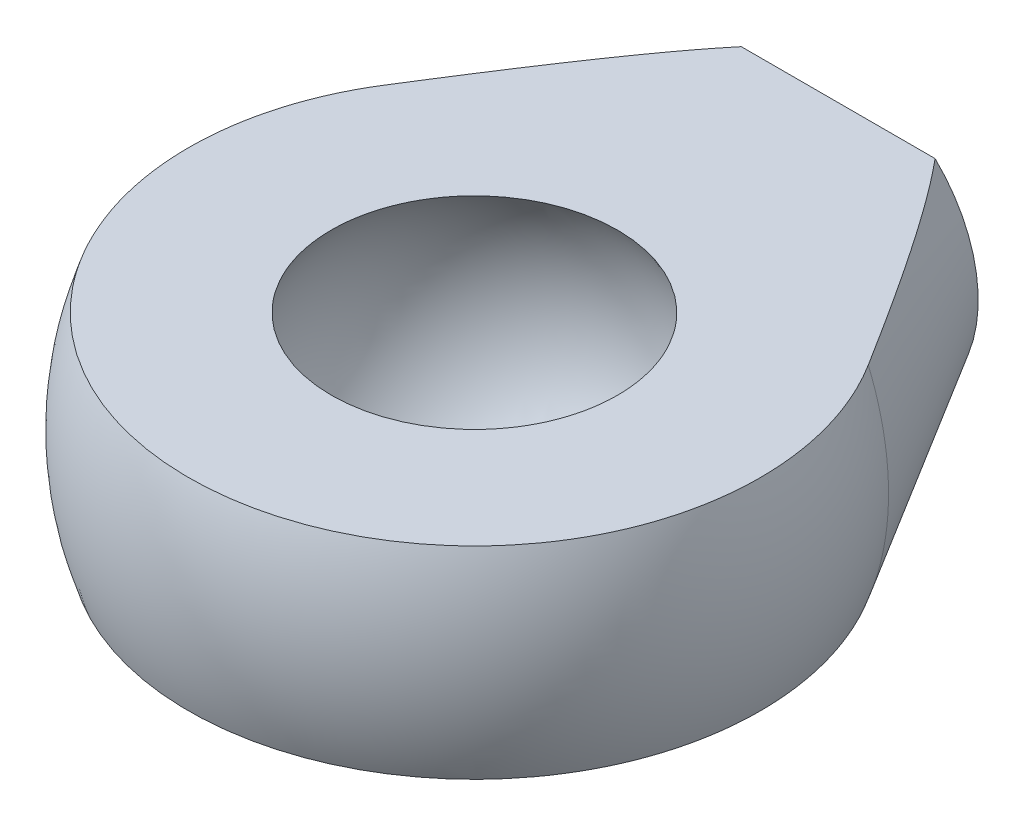
ISO-10303-21;
HEADER;
FILE_DESCRIPTION(('STEP AP214'),'2;1');
FILE_NAME('part.step','',(''),(''),'','','');
FILE_SCHEMA(('AUTOMOTIVE_DESIGN { 1 0 10303 214 1 1 1 1 }'));
ENDSEC;
DATA;
#1=APPLICATION_CONTEXT('core data for automotive mechanical design processes');
#2=APPLICATION_PROTOCOL_DEFINITION('international standard','automotive_design',2000,#1);
#3=PRODUCT_CONTEXT('',#1,'mechanical');
#4=PRODUCT('Part','Part','',(#3));
#5=PRODUCT_RELATED_PRODUCT_CATEGORY('part','',(#4));
#6=PRODUCT_DEFINITION_FORMATION('','',#4);
#7=PRODUCT_DEFINITION_CONTEXT('part definition',#1,'design');
#8=PRODUCT_DEFINITION('design','',#6,#7);
#9=PRODUCT_DEFINITION_SHAPE('','',#8);
#10=(LENGTH_UNIT() NAMED_UNIT(*) SI_UNIT(.MILLI.,.METRE.));
#11=(NAMED_UNIT(*) PLANE_ANGLE_UNIT() SI_UNIT($,.RADIAN.));
#12=(NAMED_UNIT(*) SI_UNIT($,.STERADIAN.) SOLID_ANGLE_UNIT());
#13=UNCERTAINTY_MEASURE_WITH_UNIT(LENGTH_MEASURE(1.E-05),#10,'distance_accuracy_value','');
#14=(GEOMETRIC_REPRESENTATION_CONTEXT(3) GLOBAL_UNCERTAINTY_ASSIGNED_CONTEXT((#13)) GLOBAL_UNIT_ASSIGNED_CONTEXT((#10,
#11,#12)) REPRESENTATION_CONTEXT('',''));
#15=CARTESIAN_POINT('',(0.,0.,0.));
#16=DIRECTION('',(0.,0.,1.));
#17=DIRECTION('',(1.,0.,0.));
#18=AXIS2_PLACEMENT_3D('',#15,#16,#17);
#19=CARTESIAN_POINT('',(0.,-1.5,0.));
#20=DIRECTION('',(0.,-1.,0.));
#21=DIRECTION('',(0.,0.,-1.));
#22=AXIS2_PLACEMENT_3D('',#19,#20,#21);
#23=PLANE('',#22);
#24=CARTESIAN_POINT('',(0.,-1.5,-2.1242881748953));
#25=CARTESIAN_POINT('',(-0.0596433501799828,-1.5,-2.12428781747219));
#26=CARTESIAN_POINT('',(-0.119297661436686,-1.5,-2.1217740317695));
#27=CARTESIAN_POINT('',(-0.238194036164754,-1.5,-2.11173523210911));
#28=CARTESIAN_POINT('',(-0.297435972708527,-1.5,-2.10420873867984));
#29=CARTESIAN_POINT('',(-0.415174931081974,-1.5,-2.08417838552678));
#30=CARTESIAN_POINT('',(-0.473670617593994,-1.5,-2.07166662480167));
#31=CARTESIAN_POINT('',(-0.589432561414114,-1.5,-2.04175198275292));
#32=CARTESIAN_POINT('',(-0.64669778027005,-1.5,-2.02434513225326));
#33=CARTESIAN_POINT('',(-0.815789120495362,-1.5,-1.96502260528374));
#34=CARTESIAN_POINT('',(-0.925195491964696,-1.5,-1.91595622676022));
#35=CARTESIAN_POINT('',(-1.1342056390693,-1.5,-1.80012611645185));
#36=CARTESIAN_POINT('',(-1.23380904186888,-1.5,-1.73336171191547));
#37=CARTESIAN_POINT('',(-1.37369788631977,-1.5,-1.62146155297761));
#38=CARTESIAN_POINT('',(-1.41876780957782,-1.5,-1.58217303095265));
#39=CARTESIAN_POINT('',(-1.50540664116416,-1.5,-1.49996985876689));
#40=CARTESIAN_POINT('',(-1.54697888310177,-1.5,-1.45705874126185));
#41=CARTESIAN_POINT('',(-1.62637882588234,-1.5,-1.36786636416899));
#42=CARTESIAN_POINT('',(-1.66420482194891,-1.5,-1.3215835867405));
#43=CARTESIAN_POINT('',(-1.73582719296633,-1.5,-1.22600022936428));
#44=CARTESIAN_POINT('',(-1.76962263258221,-1.5,-1.17669895294212));
#45=CARTESIAN_POINT('',(-1.86456337323386,-1.5,-1.02480495292632));
#46=CARTESIAN_POINT('',(-1.91934685152455,-1.5,-0.918127799425912));
#47=CARTESIAN_POINT('',(-2.01019330865678,-1.5,-0.697147758824447));
#48=CARTESIAN_POINT('',(-2.04625648743986,-1.5,-0.582844953183635));
#49=CARTESIAN_POINT('',(-2.09869085004264,-1.5,-0.349792473371839));
#50=CARTESIAN_POINT('',(-2.11506192869818,-1.5,-0.231042775456053));
#51=CARTESIAN_POINT('',(-2.12763041529676,-1.5,0.00751945629941201));
#52=CARTESIAN_POINT('',(-2.1238278232398,-1.5,0.127331990139092));
#53=CARTESIAN_POINT('',(-2.09617217962121,-1.5,0.364603956675449));
#54=CARTESIAN_POINT('',(-2.0723192351366,-1.5,0.482063401935145));
#55=CARTESIAN_POINT('',(-2.00519560751734,-1.5,0.71136598746992));
#56=CARTESIAN_POINT('',(-1.9619247169884,-1.5,0.823209067744962));
#57=CARTESIAN_POINT('',(-1.88347011997211,-1.5,0.984238281502264));
#58=CARTESIAN_POINT('',(-1.85504219726561,-1.5,1.03681775284116));
#59=CARTESIAN_POINT('',(-1.79385993013636,-1.5,1.13939783095768));
#60=CARTESIAN_POINT('',(-1.76110658905406,-1.5,1.18939903207195));
#61=CARTESIAN_POINT('',(-1.69151826126868,-1.5,1.28644075341421));
#62=CARTESIAN_POINT('',(-1.65468512939462,-1.5,1.33348260394752));
#63=CARTESIAN_POINT('',(-1.57716358218383,-1.5,1.42433445243777));
#64=CARTESIAN_POINT('',(-1.53647148049162,-1.5,1.46814128758095));
#65=CARTESIAN_POINT('',(-1.40911517678683,-1.5,1.59412107277989));
#66=CARTESIAN_POINT('',(-1.31707857018427,-1.50000000000002,1.67098189900128));
#67=CARTESIAN_POINT('',(-1.12139656031811,-1.49999999999998,1.808132936407));
#68=CARTESIAN_POINT('',(-1.01775159851692,-1.49999999999992,1.86842377744214));
#69=CARTESIAN_POINT('',(-0.855829763368571,-1.49999999999996,1.94518550519386));
#70=CARTESIAN_POINT('',(-0.800710618477808,-1.49999999999999,1.96851324836477));
#71=CARTESIAN_POINT('',(-0.68873286184711,-1.50000000000001,2.01042619941665));
#72=CARTESIAN_POINT('',(-0.631875699879535,-1.5,2.02901524538326));
#73=CARTESIAN_POINT('',(-0.516893262189035,-1.5,2.06130636473603));
#74=CARTESIAN_POINT('',(-0.458770144604808,-1.5,2.07501615507318));
#75=CARTESIAN_POINT('',(-0.341586815795197,-1.5,2.09749265104566));
#76=CARTESIAN_POINT('',(-0.282526886253126,-1.5,2.10626081462519));
#77=CARTESIAN_POINT('',(-0.186146182269117,-1.5,2.11644516688593));
#78=CARTESIAN_POINT('',(-0.148979720151722,-1.5,2.11938536415249));
#79=CARTESIAN_POINT('',(-0.0745435990049219,-1.5,2.12330697984244));
#80=CARTESIAN_POINT('',(-0.0372739399755158,-1.5,2.12428839826584));
#81=CARTESIAN_POINT('',(0.0596433501799825,-1.5,2.12428781747219));
#82=CARTESIAN_POINT('',(0.119297661436686,-1.5,2.1217740317695));
#83=CARTESIAN_POINT('',(0.238194036164754,-1.5,2.11173523210911));
#84=CARTESIAN_POINT('',(0.297435972708526,-1.5,2.10420873867984));
#85=CARTESIAN_POINT('',(0.415174931081974,-1.5,2.08417838552678));
#86=CARTESIAN_POINT('',(0.473670617593994,-1.5,2.07166662480167));
#87=CARTESIAN_POINT('',(0.589432561414114,-1.5,2.04175198275292));
#88=CARTESIAN_POINT('',(0.64669778027005,-1.5,2.02434513225326));
#89=CARTESIAN_POINT('',(0.815789120495362,-1.5,1.96502260528374));
#90=CARTESIAN_POINT('',(0.925195491964696,-1.5,1.91595622676022));
#91=CARTESIAN_POINT('',(1.1342056390693,-1.5,1.80012611645185));
#92=CARTESIAN_POINT('',(1.23380904186888,-1.5,1.73336171191547));
#93=CARTESIAN_POINT('',(1.37369788631977,-1.5,1.62146155297761));
#94=CARTESIAN_POINT('',(1.41876780957782,-1.5,1.58217303095265));
#95=CARTESIAN_POINT('',(1.50540664116416,-1.5,1.49996985876689));
#96=CARTESIAN_POINT('',(1.54697888310177,-1.5,1.45705874126185));
#97=CARTESIAN_POINT('',(1.62637882588234,-1.5,1.36786636416899));
#98=CARTESIAN_POINT('',(1.66420482194891,-1.5,1.3215835867405));
#99=CARTESIAN_POINT('',(1.73582719296633,-1.5,1.22600022936428));
#100=CARTESIAN_POINT('',(1.76962263258221,-1.5,1.17669895294212));
#101=CARTESIAN_POINT('',(1.86456337323386,-1.5,1.02480495292632));
#102=CARTESIAN_POINT('',(1.91934685152455,-1.5,0.918127799425912));
#103=CARTESIAN_POINT('',(2.01019330865678,-1.5,0.697147758824447));
#104=CARTESIAN_POINT('',(2.04625648743985,-1.5,0.582844953183636));
#105=CARTESIAN_POINT('',(2.09869085004264,-1.5,0.349792473371839));
#106=CARTESIAN_POINT('',(2.11506192869818,-1.5,0.231042775456054));
#107=CARTESIAN_POINT('',(2.12763041529676,-1.5,-0.00751945629941173));
#108=CARTESIAN_POINT('',(2.1238278232398,-1.5,-0.127331990139092));
#109=CARTESIAN_POINT('',(2.09617217962121,-1.5,-0.364603956675448));
#110=CARTESIAN_POINT('',(2.0723192351366,-1.5,-0.482063401935144));
#111=CARTESIAN_POINT('',(2.00519560751734,-1.5,-0.71136598746992));
#112=CARTESIAN_POINT('',(1.9619247169884,-1.5,-0.823209067744962));
#113=CARTESIAN_POINT('',(1.88347011997211,-1.5,-0.984238281502264));
#114=CARTESIAN_POINT('',(1.85504219726561,-1.5,-1.03681775284116));
#115=CARTESIAN_POINT('',(1.79385993013636,-1.5,-1.13939783095768));
#116=CARTESIAN_POINT('',(1.76110658905406,-1.5,-1.18939903207195));
#117=CARTESIAN_POINT('',(1.69151826126868,-1.5,-1.28644075341421));
#118=CARTESIAN_POINT('',(1.65468512939462,-1.5,-1.33348260394752));
#119=CARTESIAN_POINT('',(1.57716358218384,-1.5,-1.42433445243777));
#120=CARTESIAN_POINT('',(1.53647148049162,-1.5,-1.46814128758095));
#121=CARTESIAN_POINT('',(1.40911517678683,-1.5,-1.5941210727799));
#122=CARTESIAN_POINT('',(1.31707857018427,-1.50000000000002,-1.67098189900128));
#123=CARTESIAN_POINT('',(1.12139656031811,-1.49999999999998,-1.808132936407));
#124=CARTESIAN_POINT('',(1.01775159851692,-1.49999999999992,-1.86842377744214));
#125=CARTESIAN_POINT('',(0.855829763368571,-1.49999999999996,-1.94518550519386));
#126=CARTESIAN_POINT('',(0.800710618477808,-1.49999999999999,-1.96851324836477));
#127=CARTESIAN_POINT('',(0.68873286184711,-1.50000000000001,-2.01042619941665));
#128=CARTESIAN_POINT('',(0.631875699879535,-1.5,-2.02901524538326));
#129=CARTESIAN_POINT('',(0.516893262189034,-1.5,-2.06130636473603));
#130=CARTESIAN_POINT('',(0.458770144604808,-1.5,-2.07501615507318));
#131=CARTESIAN_POINT('',(0.341586815795196,-1.5,-2.09749265104567));
#132=CARTESIAN_POINT('',(0.282526886253126,-1.5,-2.10626081462519));
#133=CARTESIAN_POINT('',(0.186146182269116,-1.5,-2.11644516688593));
#134=CARTESIAN_POINT('',(0.148979720151722,-1.5,-2.11938536415249));
#135=CARTESIAN_POINT('',(0.0745435990049216,-1.5,-2.12330697984244));
#136=CARTESIAN_POINT('',(0.0372739399755155,-1.5,-2.12428839826584));
#137=CARTESIAN_POINT('',(0.,-1.5,-2.1242881748953));
#138=B_SPLINE_CURVE_WITH_KNOTS('',3,(#24,#25,#26,#27,#28,#29,#30,#31,#32,#33,#34,#35,#36,#37,
#38,#39,#40,#41,#42,#43,#44,#45,#46,#47,#48,#49,#50,#51,#52,#53,#54,#55,#56,#57,#58,#59,#60,#61,
#62,#63,#64,#65,#66,#67,#68,#69,#70,#71,#72,#73,#74,#75,#76,#77,#78,#79,#80,#81,#82,#83,#84,#85,
#86,#87,#88,#89,#90,#91,#92,#93,#94,#95,#96,#97,#98,#99,#100,#101,#102,#103,#104,#105,#106,#107,
#108,#109,#110,#111,#112,#113,#114,#115,#116,#117,#118,#119,#120,#121,#122,#123,#124,#125,#126,
#127,#128,#129,#130,#131,#132,#133,#134,#135,#136,#137),.UNSPECIFIED.,.T.,.F.,(4,2,2,2,2,2,2,2,
2,2,2,2,2,2,2,2,2,2,2,2,2,2,2,2,2,2,2,2,2,2,2,2,2,2,2,2,2,2,2,2,2,2,2,2,2,2,2,2,2,2,2,2,2,2,2,2,
4),(0.,0.178895736345397,0.357844296140533,0.537077601504677,0.716456659051143,1.07435969536906,
1.43227633853497,1.61146916237464,1.79048921734291,1.96959036689487,2.14873299829928,
2.50664474941335,2.86455267778396,3.22246251752633,3.58037235726871,3.93828028563932,
4.29619203675338,4.4753346681578,4.65443581770975,4.83345587267803,5.0126486965177,
5.37056533968356,5.72846837600143,5.90784743354792,6.08708073891208,6.26602929870725,
6.44492503505267,6.55672541042213,6.66852578579159,6.84742152213698,7.02637008193212,
7.20560338729626,7.38498244484273,7.74288548116064,8.10080212432655,8.27999494816622,
8.4590150031345,8.63811615268646,8.81725878409087,9.17517053520493,9.53307846357554,
9.89098830331792,10.2488981430603,10.6068060714309,10.964717822545,11.1438604539494,
11.3229616035013,11.5019816584696,11.6811744823093,12.0390911254751,12.396994161793,
12.5763732193395,12.7556065247037,12.9345550844988,13.1134508208443,13.2252511962137,
13.3370515715832),.UNSPECIFIED.);
#139=CARTESIAN_POINT('',(0.,-1.5,-2.1242881748953));
#140=VERTEX_POINT('',#139);
#141=EDGE_CURVE('E88',#140,#140,#138,.T.);
#142=ORIENTED_EDGE('',*,*,#141,.T.);
#143=EDGE_LOOP('',(#142));
#144=FACE_BOUND('',#143,.T.);
#145=CARTESIAN_POINT('',(-3.59687364247174,-1.5,-2.25000000002046));
#146=CARTESIAN_POINT('',(-3.66016648610274,-1.5,-2.14884358765808));
#147=CARTESIAN_POINT('',(-3.71916918238554,-1.5,-2.04500567807281));
#148=CARTESIAN_POINT('',(-3.82822206626107,-1.5,-1.83273662204977));
#149=CARTESIAN_POINT('',(-3.87827268237529,-1.5,-1.72430569577971));
#150=CARTESIAN_POINT('',(-3.96902340748014,-1.5,-1.50368811991572));
#151=CARTESIAN_POINT('',(-4.00973006640523,-1.5,-1.39150416471489));
#152=CARTESIAN_POINT('',(-4.08155191342972,-1.5,-1.16410846700311));
#153=CARTESIAN_POINT('',(-4.11266721807255,-1.5,-1.04889676130046));
#154=CARTESIAN_POINT('',(-4.16509251487932,-1.5,-0.81622891945181));
#155=CARTESIAN_POINT('',(-4.18639969602199,-1.5,-0.698772149900706));
#156=CARTESIAN_POINT('',(-4.21905044062337,-1.5,-0.462437565176268));
#157=CARTESIAN_POINT('',(-4.23039032001413,-1.5,-0.343559241016172));
#158=CARTESIAN_POINT('',(-4.24300875524243,-1.5,-0.105337312679449));
#159=CARTESIAN_POINT('',(-4.24429299765839,-1.5,0.0140059903337851));
#160=CARTESIAN_POINT('',(-4.23680461709442,-1.5,0.25242083103001));
#161=CARTESIAN_POINT('',(-4.22802828220747,-1.5,0.371492252154899));
#162=CARTESIAN_POINT('',(-4.20047989229082,-1.5,0.608431190827554));
#163=CARTESIAN_POINT('',(-4.18171130479281,-1.5,0.726299111563895));
#164=CARTESIAN_POINT('',(-4.13430515941184,-1.5,0.960078713597451));
#165=CARTESIAN_POINT('',(-4.10566395981821,-1.5,1.0759896564509));
#166=CARTESIAN_POINT('',(-4.03872502084066,-1.5,1.30496144182543));
#167=CARTESIAN_POINT('',(-4.00042937983335,-1.5,1.41802289781153));
#168=CARTESIAN_POINT('',(-3.91443476494535,-1.5,1.64055938354326));
#169=CARTESIAN_POINT('',(-3.86673232371032,-1.5,1.7500330734309));
#170=CARTESIAN_POINT('',(-3.76229403055324,-1.5,1.96452704700997));
#171=CARTESIAN_POINT('',(-3.70556192401752,-1.5,2.06954915438754));
#172=CARTESIAN_POINT('',(-3.583430789689,-1.5,2.27447953125269));
#173=CARTESIAN_POINT('',(-3.51802857012733,-1.5,2.37438589859175));
#174=CARTESIAN_POINT('',(-3.37906857581263,-1.5,2.5682905992338));
#175=CARTESIAN_POINT('',(-3.30551433439744,-1.5,2.66229146469679));
#176=CARTESIAN_POINT('',(-3.15072160411858,-1.5,2.84379766539452));
#177=CARTESIAN_POINT('',(-3.06948028852261,-1.5,2.93130058989506));
#178=CARTESIAN_POINT('',(-2.89994290223442,-1.5,3.09912118406989));
#179=CARTESIAN_POINT('',(-2.8116492967688,-1.5,3.1794413439497));
#180=CARTESIAN_POINT('',(-2.62857925740194,-1.5,3.33238737633861));
#181=CARTESIAN_POINT('',(-2.53380044197557,-1.5,3.40501039704762));
#182=CARTESIAN_POINT('',(-2.33848624451858,-1.5,3.54199057111996));
#183=CARTESIAN_POINT('',(-2.23795287939269,-1.5,3.60635059523164));
#184=CARTESIAN_POINT('',(-2.03181680024242,-1.5,3.72638879066738));
#185=CARTESIAN_POINT('',(-1.9262122282587,-1.5,3.78206374777494));
#186=CARTESIAN_POINT('',(-1.60297680040969,-1.5,3.93537673603601));
#187=CARTESIAN_POINT('',(-1.37871029324724,-1.5,4.01945263801202));
#188=CARTESIAN_POINT('',(-0.919366684705529,-1.5,4.14870763235848));
#189=CARTESIAN_POINT('',(-0.684289643786539,-1.5,4.19388694223873));
#190=CARTESIAN_POINT('',(-0.20985433127113,-1.5,4.24415231766457));
#191=CARTESIAN_POINT('',(0.0295039520676562,-1.5,4.24923827322731));
#192=CARTESIAN_POINT('',(0.505668438106536,-1.5,4.21914944302647));
#193=CARTESIAN_POINT('',(0.74247464053679,-1.5,4.18397465300605));
#194=CARTESIAN_POINT('',(1.20682242644605,-1.5,4.07436906378546));
#195=CARTESIAN_POINT('',(1.43436402860284,-1.5,3.999938343731));
#196=CARTESIAN_POINT('',(1.87372204373422,-1.5,3.81393179455648));
#197=CARTESIAN_POINT('',(2.08553839495949,-1.5,3.70235581958531));
#198=CARTESIAN_POINT('',(2.48743339741659,-1.5,3.44522621814822));
#199=CARTESIAN_POINT('',(2.67751198302543,-1.5,3.29967248911268));
#200=CARTESIAN_POINT('',(3.03053290819607,-1.5,2.97872089771846));
#201=CARTESIAN_POINT('',(3.19347551812573,-1.5,2.80332333274249));
#202=CARTESIAN_POINT('',(3.48760142628689,-1.5,2.42766231652455));
#203=CARTESIAN_POINT('',(3.61878474185976,-1.5,2.22739887886006));
#204=CARTESIAN_POINT('',(3.84566929564412,-1.5,1.80768797546887));
#205=CARTESIAN_POINT('',(3.9413701415426,-1.5,1.58824029766417));
#206=CARTESIAN_POINT('',(4.09456917912459,-1.5,1.13640265773554));
#207=CARTESIAN_POINT('',(4.15206876187074,-1.5,0.904013167209428));
#208=CARTESIAN_POINT('',(4.22723747360407,-1.5,0.432858932588479));
#209=CARTESIAN_POINT('',(4.24490414171592,-1.5,0.194093795528538));
#210=CARTESIAN_POINT('',(4.23991088139972,-1.5,-0.283054690440434));
#211=CARTESIAN_POINT('',(4.21724031700192,-1.5,-0.521437922060977));
#212=CARTESIAN_POINT('',(4.1321709061261,-1.5,-0.990954988684261));
#213=CARTESIAN_POINT('',(4.06979546947232,-1.5,-1.22209301123225));
#214=CARTESIAN_POINT('',(3.93760252664816,-1.5,-1.58671881688715));
#215=CARTESIAN_POINT('',(3.87923983777165,-1.5,-1.72447117689292));
#216=CARTESIAN_POINT('',(3.74844010659473,-1.5,-1.9928529504994));
#217=CARTESIAN_POINT('',(3.67602550010648,-1.5,-2.12349329915604));
#218=CARTESIAN_POINT('',(3.59687364247174,-1.5,-2.25000000002047));
#219=B_SPLINE_CURVE_WITH_KNOTS('',3,(#145,#146,#147,#148,#149,#150,#151,#152,#153,#154,#155,
#156,#157,#158,#159,#160,#161,#162,#163,#164,#165,#166,#167,#168,#169,#170,#171,#172,#173,#174,
#175,#176,#177,#178,#179,#180,#181,#182,#183,#184,#185,#186,#187,#188,#189,#190,#191,#192,#193,
#194,#195,#196,#197,#198,#199,#200,#201,#202,#203,#204,#205,#206,#207,#208,#209,#210,#211,#212,
#213,#214,#215,#216,#217,#218),.UNSPECIFIED.,.F.,.F.,(4,2,2,2,2,2,2,2,2,2,2,2,2,2,2,2,2,2,2,2,2,
2,2,2,2,2,2,2,2,2,2,2,2,2,2,2,4),(0.,0.357867597519552,0.715718059913326,1.07331690471403,
1.43091140420148,1.78860832703733,2.14643740462557,2.50406411112749,2.86182280850995,
3.21945743659209,3.5772241267896,3.93491312393784,4.29273421282335,4.6504072671739,
5.0082123609227,5.36586297295895,5.72364561714289,6.08130373620363,6.43909390821696,
6.79675943766075,7.15455702146352,7.86937863186241,8.58419624495179,9.29901581890621,
10.0138354684401,10.7286536767983,11.4434746919284,12.1582978649371,12.8731139154165,
13.5879295755877,14.3027531389047,15.0175506711747,15.7323923623881,16.447422568303,
17.1620315854329,17.6100822609502,18.0574233624195),.UNSPECIFIED.);
#220=CARTESIAN_POINT('',(-3.59687364246384,-1.5,-2.25000000001552));
#221=VERTEX_POINT('',#220);
#222=CARTESIAN_POINT('',(3.59687364246384,-1.5,-2.25000000001552));
#223=VERTEX_POINT('',#222);
#224=EDGE_CURVE('E83',#221,#223,#219,.T.);
#225=ORIENTED_EDGE('',*,*,#224,.F.);
#226=CARTESIAN_POINT('',(-1.43874945699565,-1.5,-5.40000000000609));
#227=CARTESIAN_POINT('',(-1.47591612421402,-1.5,-5.3554293566579));
#228=CARTESIAN_POINT('',(-1.51264786322895,-1.5,-5.31050045561087));
#229=CARTESIAN_POINT('',(-1.58535358097923,-1.5,-5.22003913262845));
#230=CARTESIAN_POINT('',(-1.62132762126952,-1.5,-5.17450676021215));
#231=CARTESIAN_POINT('',(-1.72826886645664,-1.5,-5.03719039461842));
#232=CARTESIAN_POINT('',(-1.79827738053268,-1.5,-4.94466025146374));
#233=CARTESIAN_POINT('',(-1.93632444555741,-1.5,-4.75824674101744));
#234=CARTESIAN_POINT('',(-2.00436428913433,-1.5,-4.66436432521449));
#235=CARTESIAN_POINT('',(-2.13896093517215,-1.5,-4.47553230574838));
#236=CARTESIAN_POINT('',(-2.20551760637569,-1.5,-4.38058260874311));
#237=CARTESIAN_POINT('',(-2.40330768753884,-1.5,-4.09472619121784));
#238=CARTESIAN_POINT('',(-2.53280244769128,-1.5,-3.90261822200739));
#239=CARTESIAN_POINT('',(-2.7887801448352,-1.5,-3.51637407991046));
#240=CARTESIAN_POINT('',(-2.91526257808402,-1.5,-3.32223757549978));
#241=CARTESIAN_POINT('',(-3.08753558766153,-1.5,-3.05463569374974));
#242=CARTESIAN_POINT('',(-3.13424181378348,-1.5,-2.98175808994254));
#243=CARTESIAN_POINT('',(-3.22738702318999,-1.5,-2.83583802675682));
#244=CARTESIAN_POINT('',(-3.2738260214451,-1.5,-2.76279557693879));
#245=CARTESIAN_POINT('',(-3.36648536428253,-1.5,-2.61653859673522));
#246=CARTESIAN_POINT('',(-3.4127056320673,-1.5,-2.54332401772408));
#247=CARTESIAN_POINT('',(-3.50493931079833,-1.5,-2.39675888201167));
#248=CARTESIAN_POINT('',(-3.55095270989775,-1.5,-2.32340831785422));
#249=CARTESIAN_POINT('',(-3.59687364245595,-1.5,-2.25000000001059));
#250=B_SPLINE_CURVE_WITH_KNOTS('',3,(#226,#227,#228,#229,#230,#231,#232,#233,#234,#235,#236,
#237,#238,#239,#240,#241,#242,#243,#244,#245,#246,#247,#248,#249),.UNSPECIFIED.,.F.,.F.,(4,2,2,
2,2,2,2,2,2,2,2,4),(0.,0.17409306056334,0.348171922938345,0.696225083109989,1.04404427219552,
1.3918941212148,2.0868742596837,2.78196981300713,3.0416491390515,3.30131377296527,
3.56106366343395,3.82082824432761),.UNSPECIFIED.);
#251=CARTESIAN_POINT('',(-1.43874945699455,-1.5,-5.40000000000741));
#252=VERTEX_POINT('',#251);
#253=EDGE_CURVE('E18',#252,#221,#250,.T.);
#254=ORIENTED_EDGE('',*,*,#253,.F.);
#255=DIRECTION('',(1.,0.,0.));
#256=VECTOR('',#255,1.);
#257=CARTESIAN_POINT('',(0.,-1.5,-5.4));
#258=LINE('',#257,#256);
#259=CARTESIAN_POINT('',(1.43874945699455,-1.5,-5.40000000000741));
#260=VERTEX_POINT('',#259);
#261=EDGE_CURVE('E78',#252,#260,#258,.T.);
#262=ORIENTED_EDGE('',*,*,#261,.T.);
#263=CARTESIAN_POINT('',(3.59687364245594,-1.5,-2.25000000001058));
#264=CARTESIAN_POINT('',(3.51243697101922,-1.5,-2.38496128149103));
#265=CARTESIAN_POINT('',(3.4277002694471,-1.5,-2.51973643151689));
#266=CARTESIAN_POINT('',(3.25744667817795,-1.5,-2.78878732896594));
#267=CARTESIAN_POINT('',(3.17192981113022,-1.5,-2.92306309072876));
#268=CARTESIAN_POINT('',(3.00000429298834,-1.5,-3.19088156142072));
#269=CARTESIAN_POINT('',(2.91359646529613,-1.5,-3.3244247981803));
#270=CARTESIAN_POINT('',(2.73954679578196,-1.5,-3.59071678198972));
#271=CARTESIAN_POINT('',(2.65190488599925,-1.5,-3.72346548470645));
#272=CARTESIAN_POINT('',(2.47494914756113,-1.5,-3.98800221864868));
#273=CARTESIAN_POINT('',(2.38563401486715,-1.5,-4.11978937903007));
#274=CARTESIAN_POINT('',(2.20487565736066,-1.5,-4.38187723221269));
#275=CARTESIAN_POINT('',(2.11343273383277,-1.5,-4.51217813161422));
#276=CARTESIAN_POINT('',(1.97399532029799,-1.5,-4.70608713567204));
#277=CARTESIAN_POINT('',(1.92711496621124,-1.5,-4.77049606916635));
#278=CARTESIAN_POINT('',(1.83245760164088,-1.5,-4.8986481719796));
#279=CARTESIAN_POINT('',(1.78468063195477,-1.5,-4.96239137138613));
#280=CARTESIAN_POINT('',(1.68802295663463,-1.5,-5.08908608527839));
#281=CARTESIAN_POINT('',(1.63914174500408,-1.5,-5.15203721536472));
#282=CARTESIAN_POINT('',(1.54002542486148,-1.5,-5.27687886838945));
#283=CARTESIAN_POINT('',(1.48979010521185,-1.5,-5.33876922343791));
#284=CARTESIAN_POINT('',(1.43874945699567,-1.5,-5.40000000000611));
#285=B_SPLINE_CURVE_WITH_KNOTS('',3,(#263,#264,#265,#266,#267,#268,#269,#270,#271,#272,#273,
#274,#275,#276,#277,#278,#279,#280,#281,#282,#283,#284),.UNSPECIFIED.,.F.,.F.,(4,2,2,2,2,2,2,2,
2,2,4),(0.,0.477596528390803,0.955179235332607,1.43235433995295,1.90955582613107,
2.38714611874845,2.86466919357663,3.10365358193883,3.34262712234961,3.58171248260698,
3.8208353400825),.UNSPECIFIED.);
#286=EDGE_CURVE('E91',#223,#260,#285,.T.);
#287=ORIENTED_EDGE('',*,*,#286,.F.);
#288=EDGE_LOOP('',(#225,#254,#262,#287));
#289=FACE_BOUND('',#288,.T.);
#290=ADVANCED_FACE('F14',(#144,#289),#23,.T.);
#291=CARTESIAN_POINT('',(0.,0.,-5.4));
#292=DIRECTION('',(0.,0.,1.));
#293=DIRECTION('',(1.,0.,0.));
#294=AXIS2_PLACEMENT_3D('',#291,#292,#293);
#295=PLANE('',#294);
#296=ORIENTED_EDGE('',*,*,#261,.F.);
#297=CARTESIAN_POINT('',(0.,0.,-5.40000000000873));
#298=DIRECTION('',(0.,0.,1.));
#299=DIRECTION('',(1.,0.,0.));
#300=AXIS2_PLACEMENT_3D('',#297,#298,#299);
#301=CIRCLE('',#300,2.0784609690824);
#302=CARTESIAN_POINT('',(-1.43874945699523,1.5,-5.40000000000659));
#303=VERTEX_POINT('',#302);
#304=EDGE_CURVE('E68',#303,#252,#301,.T.);
#305=ORIENTED_EDGE('',*,*,#304,.F.);
#306=DIRECTION('',(1.,0.,0.));
#307=VECTOR('',#306,1.);
#308=CARTESIAN_POINT('',(0.,1.5,-5.4));
#309=LINE('',#308,#307);
#310=CARTESIAN_POINT('',(1.43874945699709,1.5,-5.40000000000437));
#311=VERTEX_POINT('',#310);
#312=EDGE_CURVE('E153',#311,#303,#309,.F.);
#313=ORIENTED_EDGE('',*,*,#312,.F.);
#314=CARTESIAN_POINT('',(0.,0.,-5.40000000000873));
#315=DIRECTION('',(0.,0.,1.));
#316=DIRECTION('',(1.,0.,0.));
#317=AXIS2_PLACEMENT_3D('',#314,#315,#316);
#318=CIRCLE('',#317,2.0784609690824);
#319=EDGE_CURVE('E86',#260,#311,#318,.T.);
#320=ORIENTED_EDGE('',*,*,#319,.F.);
#321=EDGE_LOOP('',(#296,#305,#313,#320));
#322=FACE_BOUND('',#321,.T.);
#323=ADVANCED_FACE('F84',(#322),#295,.F.);
#324=CARTESIAN_POINT('',(0.,0.,-2.25000000011732));
#325=DIRECTION('',(0.,0.,1.));
#326=DIRECTION('',(1.,0.,0.));
#327=AXIS2_PLACEMENT_3D('',#324,#325,#326);
#328=CONICAL_SURFACE('',#327,3.89711431694195,0.52359877559233);
#329=CARTESIAN_POINT('',(-1.43874945699702,1.5,-5.40000000000445));
#330=CARTESIAN_POINT('',(-1.47591612421539,1.5,-5.35542935665622));
#331=CARTESIAN_POINT('',(-1.51264786323034,1.5,-5.31050045560916));
#332=CARTESIAN_POINT('',(-1.58535358098062,1.5,-5.2200391326267));
#333=CARTESIAN_POINT('',(-1.62132762127092,1.5,-5.17450676021036));
#334=CARTESIAN_POINT('',(-1.72826886645806,1.5,-5.03719039461656));
#335=CARTESIAN_POINT('',(-1.79827738053412,1.5,-4.94466025146182));
#336=CARTESIAN_POINT('',(-1.93632444555889,1.5,-4.75824674101542));
#337=CARTESIAN_POINT('',(-2.00436428913582,1.5,-4.66436432521242));
#338=CARTESIAN_POINT('',(-2.13896093517368,1.5,-4.47553230574621));
#339=CARTESIAN_POINT('',(-2.20551760637724,1.5,-4.38058260874089));
#340=CARTESIAN_POINT('',(-2.40330768754045,1.5,-4.09472619121547));
#341=CARTESIAN_POINT('',(-2.53280244769293,1.5,-3.90261822200493));
#342=CARTESIAN_POINT('',(-2.78878014483694,1.5,-3.5163740799078));
#343=CARTESIAN_POINT('',(-2.91526257808581,1.5,-3.32223757549703));
#344=CARTESIAN_POINT('',(-3.0875355876637,1.5,-3.05463569374636));
#345=CARTESIAN_POINT('',(-3.134241813786,1.5,-2.98175808993861));
#346=CARTESIAN_POINT('',(-3.22738702319319,1.5,-2.83583802675179));
#347=CARTESIAN_POINT('',(-3.27382602144864,1.5,-2.76279557693321));
#348=CARTESIAN_POINT('',(-3.36648536428674,1.5,-2.61653859672855));
#349=CARTESIAN_POINT('',(-3.41270563207186,1.5,-2.54332401771685));
#350=CARTESIAN_POINT('',(-3.50493931080356,1.5,-2.39675888200334));
#351=CARTESIAN_POINT('',(-3.55095270990331,1.5,-2.32340831784535));
#352=CARTESIAN_POINT('',(-3.59687364246184,1.5,-2.25000000000116));
#353=B_SPLINE_CURVE_WITH_KNOTS('',3,(#329,#330,#331,#332,#333,#334,#335,#336,#337,#338,#339,
#340,#341,#342,#343,#344,#345,#346,#347,#348,#349,#350,#351,#352),.UNSPECIFIED.,.F.,.F.,(4,2,2,
2,2,2,2,2,2,2,2,4),(0.,0.174093060563417,0.348171922938498,0.696225083110296,1.04404427219598,
1.39189412121542,2.08687425968462,2.78196981300837,3.04164913905467,3.30131377297038,
3.56106366344099,3.82082824433659),.UNSPECIFIED.);
#354=CARTESIAN_POINT('',(-3.59687364245117,1.5,-2.25000000003577));
#355=VERTEX_POINT('',#354);
#356=EDGE_CURVE('E73',#303,#355,#353,.T.);
#357=ORIENTED_EDGE('',*,*,#356,.F.);
#358=ORIENTED_EDGE('',*,*,#304,.T.);
#359=ORIENTED_EDGE('',*,*,#253,.T.);
#360=CARTESIAN_POINT('',(0.,0.,-2.25000000006048));
#361=DIRECTION('',(0.,0.,1.));
#362=DIRECTION('',(1.,0.,0.));
#363=AXIS2_PLACEMENT_3D('',#360,#361,#362);
#364=CIRCLE('',#363,3.89711431697477);
#365=EDGE_CURVE('E77',#355,#221,#364,.T.);
#366=ORIENTED_EDGE('',*,*,#365,.F.);
#367=EDGE_LOOP('',(#357,#358,#359,#366));
#368=FACE_BOUND('',#367,.T.);
#369=ADVANCED_FACE('F70',(#368),#328,.T.);
#370=CARTESIAN_POINT('',(0.,0.,0.));
#371=DIRECTION('',(1.,0.,0.));
#372=DIRECTION('',(0.,1.,0.));
#373=AXIS2_PLACEMENT_3D('',#370,#371,#372);
#374=SPHERICAL_SURFACE('',#373,4.5);
#375=CARTESIAN_POINT('',(4.5,0.,0.));
#376=VERTEX_POINT('',#375);
#377=VERTEX_LOOP('',#376);
#378=FACE_BOUND('',#377,.T.);
#379=ORIENTED_EDGE('',*,*,#224,.T.);
#380=CARTESIAN_POINT('',(0.,0.,-2.25000000006048));
#381=DIRECTION('',(0.,0.,1.));
#382=DIRECTION('',(1.,0.,0.));
#383=AXIS2_PLACEMENT_3D('',#380,#381,#382);
#384=CIRCLE('',#383,3.89711431697477);
#385=CARTESIAN_POINT('',(3.59687364244328,1.5,-2.25000000003083));
#386=VERTEX_POINT('',#385);
#387=EDGE_CURVE('E38',#386,#223,#384,.F.);
#388=ORIENTED_EDGE('',*,*,#387,.F.);
#389=CARTESIAN_POINT('',(-3.59687364247762,1.5,-2.25000000001106));
#390=CARTESIAN_POINT('',(-3.66016648610836,1.5,-2.14884358764852));
#391=CARTESIAN_POINT('',(-3.71916918239089,1.5,-2.04500567806309));
#392=CARTESIAN_POINT('',(-3.82822206626586,1.5,-1.83273662203977));
#393=CARTESIAN_POINT('',(-3.87827268237979,1.5,-1.72430569576957));
#394=CARTESIAN_POINT('',(-3.96902340748407,1.5,-1.50368811990534));
#395=CARTESIAN_POINT('',(-4.00973006640887,1.5,-1.39150416470442));
#396=CARTESIAN_POINT('',(-4.08155191343276,1.5,-1.16410846699245));
#397=CARTESIAN_POINT('',(-4.11266721807529,1.5,-1.04889676128971));
#398=CARTESIAN_POINT('',(-4.16509251488146,1.5,-0.816228919440925));
#399=CARTESIAN_POINT('',(-4.18639969602381,1.5,-0.698772149889765));
#400=CARTESIAN_POINT('',(-4.21905044062458,1.5,-0.462437565165242));
#401=CARTESIAN_POINT('',(-4.23039032001503,1.5,-0.343559241005116));
#402=CARTESIAN_POINT('',(-4.24300875524271,1.5,-0.105337312668361));
#403=CARTESIAN_POINT('',(-4.24429299765836,1.5,0.0140059903448772));
#404=CARTESIAN_POINT('',(-4.23680461709376,1.5,0.252420831041083));
#405=CARTESIAN_POINT('',(-4.2280282822065,1.5,0.371492252165949));
#406=CARTESIAN_POINT('',(-4.20047989228923,1.5,0.608431190838532));
#407=CARTESIAN_POINT('',(-4.18171130479091,1.5,0.726299111574823));
#408=CARTESIAN_POINT('',(-4.13430515940933,1.5,0.960078713608255));
#409=CARTESIAN_POINT('',(-4.1056639598154,1.5,1.07598965646163));
#410=CARTESIAN_POINT('',(-4.03872502083725,1.5,1.30496144183598));
#411=CARTESIAN_POINT('',(-4.00042937982965,1.5,1.41802289782198));
#412=CARTESIAN_POINT('',(-3.91443476494107,1.5,1.64055938355348));
#413=CARTESIAN_POINT('',(-3.86673232370575,1.5,1.75003307344101));
#414=CARTESIAN_POINT('',(-3.76229403054811,1.5,1.96452704701981));
#415=CARTESIAN_POINT('',(-3.70556192401211,1.5,2.06954915439723));
#416=CARTESIAN_POINT('',(-3.58343078968305,1.5,2.27447953126206));
#417=CARTESIAN_POINT('',(-3.51802857012113,1.5,2.37438589860094));
#418=CARTESIAN_POINT('',(-3.37906857580592,1.5,2.56829059924263));
#419=CARTESIAN_POINT('',(-3.30551433439048,1.5,2.66229146470543));
#420=CARTESIAN_POINT('',(-3.15072160411115,1.5,2.84379766540276));
#421=CARTESIAN_POINT('',(-3.06948028851495,1.5,2.93130058990308));
#422=CARTESIAN_POINT('',(-2.89994290222632,1.5,3.09912118407747));
#423=CARTESIAN_POINT('',(-2.8116492967605,1.5,3.17944134395704));
#424=CARTESIAN_POINT('',(-2.62857925739323,1.5,3.33238737634548));
#425=CARTESIAN_POINT('',(-2.53380044196667,1.5,3.40501039705424));
#426=CARTESIAN_POINT('',(-2.33848624450933,1.5,3.54199057112607));
#427=CARTESIAN_POINT('',(-2.23795287938326,1.5,3.60635059523749));
#428=CARTESIAN_POINT('',(-2.03181680023268,1.5,3.72638879067269));
#429=CARTESIAN_POINT('',(-1.92621222824882,1.5,3.78206374777997));
#430=CARTESIAN_POINT('',(-1.6029768003994,1.5,3.9353767360402));
#431=CARTESIAN_POINT('',(-1.37871029323673,1.5,4.01945263801563));
#432=CARTESIAN_POINT('',(-0.919366684694687,1.5,4.14870763236088));
#433=CARTESIAN_POINT('',(-0.684289643775579,1.5,4.19388694224052));
#434=CARTESIAN_POINT('',(-0.209854331260038,1.5,4.24415231766512));
#435=CARTESIAN_POINT('',(0.0295039520787616,1.5,4.24923827322723));
#436=CARTESIAN_POINT('',(0.505668438117563,1.5,4.21914944302516));
#437=CARTESIAN_POINT('',(0.742474640547725,1.5,4.18397465300411));
#438=CARTESIAN_POINT('',(1.20682242645669,1.5,4.0743690637823));
#439=CARTESIAN_POINT('',(1.4343640286133,1.5,3.99993834372725));
#440=CARTESIAN_POINT('',(1.87372204374418,1.5,3.81393179455159));
#441=CARTESIAN_POINT('',(2.08553839496916,1.5,3.70235581957986));
#442=CARTESIAN_POINT('',(2.4874333974256,1.5,3.44522621814172));
#443=CARTESIAN_POINT('',(2.67751198303406,1.5,3.29967248910568));
#444=CARTESIAN_POINT('',(3.03053290820385,1.5,2.97872089771055));
#445=CARTESIAN_POINT('',(3.19347551813306,1.5,2.80332333273415));
#446=CARTESIAN_POINT('',(3.48760142629324,1.5,2.42766231651544));
#447=CARTESIAN_POINT('',(3.61878474186558,1.5,2.22739887885061));
#448=CARTESIAN_POINT('',(3.84566929564885,1.5,1.80768797545882));
#449=CARTESIAN_POINT('',(3.94137014154675,1.5,1.58824029765387));
#450=CARTESIAN_POINT('',(4.09456917912755,1.5,1.13640265772484));
#451=CARTESIAN_POINT('',(4.1520687618731,1.5,0.904013167198581));
#452=CARTESIAN_POINT('',(4.2272374736052,1.5,0.432858932577435));
#453=CARTESIAN_POINT('',(4.24490414171643,1.5,0.194093795517447));
#454=CARTESIAN_POINT('',(4.23991088139898,1.5,-0.283054690451517));
#455=CARTESIAN_POINT('',(4.21724031700056,1.5,-0.521437922072005));
#456=CARTESIAN_POINT('',(4.13217090612351,1.5,-0.990954988695069));
#457=CARTESIAN_POINT('',(4.06979546946912,1.5,-1.22209301124289));
#458=CARTESIAN_POINT('',(3.93760252664527,1.5,-1.58671881689396));
#459=CARTESIAN_POINT('',(3.87923983777003,1.5,-1.72447117689624));
#460=CARTESIAN_POINT('',(3.74844010659635,1.5,-1.99285295049608));
#461=CARTESIAN_POINT('',(3.67602550011006,1.5,-2.12349329914957));
#462=CARTESIAN_POINT('',(3.59687364247762,1.5,-2.25000000001106));
#463=B_SPLINE_CURVE_WITH_KNOTS('',3,(#389,#390,#391,#392,#393,#394,#395,#396,#397,#398,#399,
#400,#401,#402,#403,#404,#405,#406,#407,#408,#409,#410,#411,#412,#413,#414,#415,#416,#417,#418,
#419,#420,#421,#422,#423,#424,#425,#426,#427,#428,#429,#430,#431,#432,#433,#434,#435,#436,#437,
#438,#439,#440,#441,#442,#443,#444,#445,#446,#447,#448,#449,#450,#451,#452,#453,#454,#455,#456,
#457,#458,#459,#460,#461,#462),.UNSPECIFIED.,.F.,.F.,(4,2,2,2,2,2,2,2,2,2,2,2,2,2,2,2,2,2,2,2,2,
2,2,2,2,2,2,2,2,2,2,2,2,2,2,2,4),(0.,0.357867597519552,0.715718059913326,1.07331690471403,
1.43091140420148,1.78860832703733,2.14643740462557,2.50406411112749,2.86182280850995,
3.21945743659209,3.5772241267896,3.93491312393783,4.29273421282335,4.6504072671739,
5.0082123609227,5.36586297295894,5.72364561714289,6.08130373620362,6.43909390821695,
6.79675943766075,7.15455702146352,7.86937863186241,8.58419624495179,9.29901581890621,
10.0138354684401,10.7286536767983,11.4434746919284,12.1582978649371,12.8731139154165,
13.5879295755877,14.3027531389047,15.0175506711747,15.7323923623881,16.447422568303,
17.1620315854329,17.6100822609391,18.0574233623973),.UNSPECIFIED.);
#464=EDGE_CURVE('E123',#355,#386,#463,.T.);
#465=ORIENTED_EDGE('',*,*,#464,.F.);
#466=ORIENTED_EDGE('',*,*,#365,.T.);
#467=EDGE_LOOP('',(#379,#388,#465,#466));
#468=FACE_BOUND('',#467,.T.);
#469=CARTESIAN_POINT('',(-4.5,0.,0.));
#470=VERTEX_POINT('',#469);
#471=VERTEX_LOOP('',#470);
#472=FACE_BOUND('',#471,.T.);
#473=ADVANCED_FACE('F130',(#378,#468,#472),#374,.T.);
#474=CARTESIAN_POINT('',(0.,0.,-2.25000000011732));
#475=DIRECTION('',(0.,0.,1.));
#476=DIRECTION('',(1.,0.,0.));
#477=AXIS2_PLACEMENT_3D('',#474,#475,#476);
#478=CONICAL_SURFACE('',#477,3.89711431694195,0.52359877559233);
#479=CARTESIAN_POINT('',(3.59687364246398,1.5000000000036,-2.25000000000253));
#480=CARTESIAN_POINT('',(3.5124369710257,1.50000000000129,-2.38496128148243));
#481=CARTESIAN_POINT('',(3.42770026945283,1.50000000000035,-2.51973643150825));
#482=CARTESIAN_POINT('',(3.25744667818291,1.49999999999965,-2.78878732895768));
#483=CARTESIAN_POINT('',(3.17192981113515,1.49999999999991,-2.92306309072093));
#484=CARTESIAN_POINT('',(3.00000429299301,1.50000000000009,-3.1908815614136));
#485=CARTESIAN_POINT('',(2.91359646530058,1.50000000000002,-3.32442479817348));
#486=CARTESIAN_POINT('',(2.73954679578602,1.49999999999998,-3.59071678198353));
#487=CARTESIAN_POINT('',(2.65190488600313,1.49999999999999,-3.72346548470059));
#488=CARTESIAN_POINT('',(2.47494914756465,1.50000000000001,-3.98800221864348));
#489=CARTESIAN_POINT('',(2.38563401487047,1.5,-4.1197893790252));
#490=CARTESIAN_POINT('',(2.2048756573636,1.5,-4.38187723220848));
#491=CARTESIAN_POINT('',(2.11343273383552,1.5,-4.51217813161033));
#492=CARTESIAN_POINT('',(1.97399532030046,1.5,-4.70608713566865));
#493=CARTESIAN_POINT('',(1.92711496621361,1.5,-4.77049606916311));
#494=CARTESIAN_POINT('',(1.83245760164305,1.5,-4.89864817197669));
#495=CARTESIAN_POINT('',(1.78468063195685,1.5,-4.96239137138338));
#496=CARTESIAN_POINT('',(1.68802295663651,1.5,-5.08908608527596));
#497=CARTESIAN_POINT('',(1.63914174500586,1.5,-5.15203721536244));
#498=CARTESIAN_POINT('',(1.54002542486305,1.5,-5.27687886838749));
#499=CARTESIAN_POINT('',(1.48979010521333,1.5,-5.33876922343611));
#500=CARTESIAN_POINT('',(1.43874945699704,1.5,-5.40000000000446));
#501=B_SPLINE_CURVE_WITH_KNOTS('',3,(#479,#480,#481,#482,#483,#484,#485,#486,#487,#488,#489,
#490,#491,#492,#493,#494,#495,#496,#497,#498,#499,#500),.UNSPECIFIED.,.F.,.F.,(4,2,2,2,2,2,2,2,
2,2,4),(0.,0.477596528391902,0.955179235334816,1.43235433995628,1.90955582613552,
2.38714611875402,2.86466919358334,3.1036535819461,3.34262712235745,3.58171248261537,
3.82083534009145),.UNSPECIFIED.);
#502=EDGE_CURVE('E29',#386,#311,#501,.T.);
#503=ORIENTED_EDGE('',*,*,#502,.F.);
#504=ORIENTED_EDGE('',*,*,#387,.T.);
#505=ORIENTED_EDGE('',*,*,#286,.T.);
#506=ORIENTED_EDGE('',*,*,#319,.T.);
#507=EDGE_LOOP('',(#503,#504,#505,#506));
#508=FACE_BOUND('',#507,.T.);
#509=ADVANCED_FACE('F133',(#508),#478,.T.);
#510=CARTESIAN_POINT('',(0.,0.,0.));
#511=DIRECTION('',(1.,0.,0.));
#512=DIRECTION('',(0.,1.,0.));
#513=AXIS2_PLACEMENT_3D('',#510,#511,#512);
#514=SPHERICAL_SURFACE('',#513,2.6005);
#515=CARTESIAN_POINT('',(2.6005,0.,0.));
#516=VERTEX_POINT('',#515);
#517=VERTEX_LOOP('',#516);
#518=FACE_BOUND('',#517,.T.);
#519=CARTESIAN_POINT('',(-2.6005,0.,0.));
#520=VERTEX_POINT('',#519);
#521=VERTEX_LOOP('',#520);
#522=FACE_BOUND('',#521,.T.);
#523=CARTESIAN_POINT('',(0.,1.5,2.1242881748953));
#524=CARTESIAN_POINT('',(-0.0596433501799828,1.5,2.12428781747219));
#525=CARTESIAN_POINT('',(-0.119297661436686,1.5,2.1217740317695));
#526=CARTESIAN_POINT('',(-0.238194036164754,1.5,2.11173523210911));
#527=CARTESIAN_POINT('',(-0.297435972708527,1.5,2.10420873867984));
#528=CARTESIAN_POINT('',(-0.415174931081974,1.5,2.08417838552678));
#529=CARTESIAN_POINT('',(-0.473670617593994,1.5,2.07166662480167));
#530=CARTESIAN_POINT('',(-0.589432561414114,1.5,2.04175198275292));
#531=CARTESIAN_POINT('',(-0.64669778027005,1.5,2.02434513225326));
#532=CARTESIAN_POINT('',(-0.815789120495362,1.5,1.96502260528374));
#533=CARTESIAN_POINT('',(-0.925195491964696,1.5,1.91595622676022));
#534=CARTESIAN_POINT('',(-1.1342056390693,1.5,1.80012611645185));
#535=CARTESIAN_POINT('',(-1.23380904186888,1.5,1.73336171191547));
#536=CARTESIAN_POINT('',(-1.37369788631977,1.5,1.62146155297761));
#537=CARTESIAN_POINT('',(-1.41876780957782,1.5,1.58217303095265));
#538=CARTESIAN_POINT('',(-1.50540664116416,1.5,1.49996985876689));
#539=CARTESIAN_POINT('',(-1.54697888310177,1.5,1.45705874126185));
#540=CARTESIAN_POINT('',(-1.62637882588234,1.5,1.36786636416899));
#541=CARTESIAN_POINT('',(-1.66420482194891,1.5,1.3215835867405));
#542=CARTESIAN_POINT('',(-1.73582719296633,1.5,1.22600022936428));
#543=CARTESIAN_POINT('',(-1.76962263258221,1.5,1.17669895294212));
#544=CARTESIAN_POINT('',(-1.86456337323386,1.5,1.02480495292632));
#545=CARTESIAN_POINT('',(-1.91934685152455,1.5,0.918127799425912));
#546=CARTESIAN_POINT('',(-2.01019330865678,1.5,0.697147758824447));
#547=CARTESIAN_POINT('',(-2.04625648743986,1.5,0.582844953183635));
#548=CARTESIAN_POINT('',(-2.09869085004264,1.5,0.349792473371839));
#549=CARTESIAN_POINT('',(-2.11506192869818,1.5,0.231042775456054));
#550=CARTESIAN_POINT('',(-2.12763041529676,1.5,-0.00751945629941167));
#551=CARTESIAN_POINT('',(-2.1238278232398,1.5,-0.127331990139092));
#552=CARTESIAN_POINT('',(-2.09617217962121,1.5,-0.364603956675449));
#553=CARTESIAN_POINT('',(-2.0723192351366,1.5,-0.482063401935145));
#554=CARTESIAN_POINT('',(-2.00519560751734,1.5,-0.711365987469921));
#555=CARTESIAN_POINT('',(-1.9619247169884,1.5,-0.823209067744963));
#556=CARTESIAN_POINT('',(-1.88347011997211,1.5,-0.984238281502265));
#557=CARTESIAN_POINT('',(-1.85504219726561,1.5,-1.03681775284116));
#558=CARTESIAN_POINT('',(-1.79385993013636,1.5,-1.13939783095768));
#559=CARTESIAN_POINT('',(-1.76110658905406,1.5,-1.18939903207195));
#560=CARTESIAN_POINT('',(-1.69151826126868,1.5,-1.28644075341421));
#561=CARTESIAN_POINT('',(-1.65468512939462,1.5,-1.33348260394752));
#562=CARTESIAN_POINT('',(-1.57716358218383,1.5,-1.42433445243777));
#563=CARTESIAN_POINT('',(-1.53647148049162,1.5,-1.46814128758095));
#564=CARTESIAN_POINT('',(-1.40911517678683,1.5,-1.59412107277989));
#565=CARTESIAN_POINT('',(-1.31707857018427,1.50000000000002,-1.67098189900128));
#566=CARTESIAN_POINT('',(-1.12139656031811,1.49999999999998,-1.808132936407));
#567=CARTESIAN_POINT('',(-1.01775159851692,1.49999999999992,-1.86842377744214));
#568=CARTESIAN_POINT('',(-0.85582976336857,1.49999999999996,-1.94518550519386));
#569=CARTESIAN_POINT('',(-0.800710618477807,1.49999999999999,-1.96851324836477));
#570=CARTESIAN_POINT('',(-0.688732861847109,1.50000000000001,-2.01042619941665));
#571=CARTESIAN_POINT('',(-0.631875699879534,1.5,-2.02901524538326));
#572=CARTESIAN_POINT('',(-0.516893262189034,1.5,-2.06130636473603));
#573=CARTESIAN_POINT('',(-0.458770144604807,1.5,-2.07501615507318));
#574=CARTESIAN_POINT('',(-0.341586815795196,1.5,-2.09749265104567));
#575=CARTESIAN_POINT('',(-0.282526886253125,1.5,-2.10626081462519));
#576=CARTESIAN_POINT('',(-0.186146182269116,1.5,-2.11644516688593));
#577=CARTESIAN_POINT('',(-0.148979720151722,1.5,-2.11938536415249));
#578=CARTESIAN_POINT('',(-0.0745435990049217,1.5,-2.12330697984244));
#579=CARTESIAN_POINT('',(-0.0372739399755157,1.5,-2.12428839826584));
#580=CARTESIAN_POINT('',(0.0596433501799825,1.5,-2.12428781747219));
#581=CARTESIAN_POINT('',(0.119297661436686,1.5,-2.1217740317695));
#582=CARTESIAN_POINT('',(0.238194036164754,1.5,-2.11173523210911));
#583=CARTESIAN_POINT('',(0.297435972708526,1.5,-2.10420873867984));
#584=CARTESIAN_POINT('',(0.415174931081974,1.5,-2.08417838552678));
#585=CARTESIAN_POINT('',(0.473670617593994,1.5,-2.07166662480167));
#586=CARTESIAN_POINT('',(0.589432561414114,1.5,-2.04175198275292));
#587=CARTESIAN_POINT('',(0.64669778027005,1.5,-2.02434513225326));
#588=CARTESIAN_POINT('',(0.815789120495362,1.5,-1.96502260528374));
#589=CARTESIAN_POINT('',(0.925195491964696,1.5,-1.91595622676022));
#590=CARTESIAN_POINT('',(1.1342056390693,1.5,-1.80012611645185));
#591=CARTESIAN_POINT('',(1.23380904186888,1.5,-1.73336171191547));
#592=CARTESIAN_POINT('',(1.37369788631977,1.5,-1.62146155297761));
#593=CARTESIAN_POINT('',(1.41876780957782,1.5,-1.58217303095265));
#594=CARTESIAN_POINT('',(1.50540664116416,1.5,-1.49996985876689));
#595=CARTESIAN_POINT('',(1.54697888310177,1.5,-1.45705874126185));
#596=CARTESIAN_POINT('',(1.62637882588234,1.5,-1.36786636416899));
#597=CARTESIAN_POINT('',(1.66420482194891,1.5,-1.3215835867405));
#598=CARTESIAN_POINT('',(1.73582719296633,1.5,-1.22600022936428));
#599=CARTESIAN_POINT('',(1.76962263258221,1.5,-1.17669895294212));
#600=CARTESIAN_POINT('',(1.86456337323386,1.5,-1.02480495292632));
#601=CARTESIAN_POINT('',(1.91934685152455,1.5,-0.918127799425913));
#602=CARTESIAN_POINT('',(2.01019330865678,1.5,-0.697147758824447));
#603=CARTESIAN_POINT('',(2.04625648743985,1.5,-0.582844953183636));
#604=CARTESIAN_POINT('',(2.09869085004264,1.5,-0.349792473371839));
#605=CARTESIAN_POINT('',(2.11506192869818,1.5,-0.231042775456054));
#606=CARTESIAN_POINT('',(2.12763041529676,1.5,0.00751945629941138));
#607=CARTESIAN_POINT('',(2.1238278232398,1.5,0.127331990139091));
#608=CARTESIAN_POINT('',(2.09617217962121,1.5,0.364603956675448));
#609=CARTESIAN_POINT('',(2.0723192351366,1.5,0.482063401935144));
#610=CARTESIAN_POINT('',(2.00519560751734,1.5,0.711365987469919));
#611=CARTESIAN_POINT('',(1.9619247169884,1.5,0.823209067744962));
#612=CARTESIAN_POINT('',(1.88347011997211,1.5,0.984238281502264));
#613=CARTESIAN_POINT('',(1.85504219726561,1.5,1.03681775284116));
#614=CARTESIAN_POINT('',(1.79385993013636,1.5,1.13939783095768));
#615=CARTESIAN_POINT('',(1.76110658905406,1.5,1.18939903207195));
#616=CARTESIAN_POINT('',(1.69151826126868,1.5,1.28644075341421));
#617=CARTESIAN_POINT('',(1.65468512939462,1.5,1.33348260394752));
#618=CARTESIAN_POINT('',(1.57716358218384,1.5,1.42433445243777));
#619=CARTESIAN_POINT('',(1.53647148049162,1.5,1.46814128758095));
#620=CARTESIAN_POINT('',(1.40911517678683,1.5,1.5941210727799));
#621=CARTESIAN_POINT('',(1.31707857018427,1.50000000000002,1.67098189900128));
#622=CARTESIAN_POINT('',(1.12139656031811,1.49999999999998,1.80813293640701));
#623=CARTESIAN_POINT('',(1.01775159851692,1.49999999999992,1.86842377744214));
#624=CARTESIAN_POINT('',(0.85582976336857,1.49999999999996,1.94518550519386));
#625=CARTESIAN_POINT('',(0.800710618477807,1.49999999999999,1.96851324836477));
#626=CARTESIAN_POINT('',(0.688732861847109,1.50000000000001,2.01042619941665));
#627=CARTESIAN_POINT('',(0.631875699879535,1.5,2.02901524538326));
#628=CARTESIAN_POINT('',(0.516893262189034,1.5,2.06130636473603));
#629=CARTESIAN_POINT('',(0.458770144604808,1.5,2.07501615507318));
#630=CARTESIAN_POINT('',(0.341586815795197,1.5,2.09749265104566));
#631=CARTESIAN_POINT('',(0.282526886253126,1.5,2.10626081462519));
#632=CARTESIAN_POINT('',(0.186146182269117,1.5,2.11644516688593));
#633=CARTESIAN_POINT('',(0.148979720151722,1.5,2.11938536415249));
#634=CARTESIAN_POINT('',(0.0745435990049218,1.5,2.12330697984244));
#635=CARTESIAN_POINT('',(0.0372739399755156,1.5,2.12428839826584));
#636=CARTESIAN_POINT('',(0.,1.5,2.1242881748953));
#637=B_SPLINE_CURVE_WITH_KNOTS('',3,(#523,#524,#525,#526,#527,#528,#529,#530,#531,#532,#533,
#534,#535,#536,#537,#538,#539,#540,#541,#542,#543,#544,#545,#546,#547,#548,#549,#550,#551,#552,
#553,#554,#555,#556,#557,#558,#559,#560,#561,#562,#563,#564,#565,#566,#567,#568,#569,#570,#571,
#572,#573,#574,#575,#576,#577,#578,#579,#580,#581,#582,#583,#584,#585,#586,#587,#588,#589,#590,
#591,#592,#593,#594,#595,#596,#597,#598,#599,#600,#601,#602,#603,#604,#605,#606,#607,#608,#609,
#610,#611,#612,#613,#614,#615,#616,#617,#618,#619,#620,#621,#622,#623,#624,#625,#626,#627,#628,
#629,#630,#631,#632,#633,#634,#635,#636),.UNSPECIFIED.,.T.,.F.,(4,2,2,2,2,2,2,2,2,2,2,2,2,2,2,2,
2,2,2,2,2,2,2,2,2,2,2,2,2,2,2,2,2,2,2,2,2,2,2,2,2,2,2,2,2,2,2,2,2,2,2,2,2,2,2,2,4),(0.,
0.178895736345397,0.357844296140533,0.537077601504677,0.716456659051144,1.07435969536906,
1.43227633853497,1.61146916237464,1.79048921734291,1.96959036689487,2.14873299829928,
2.50664474941335,2.86455267778396,3.22246251752633,3.58037235726871,3.93828028563932,
4.29619203675338,4.4753346681578,4.65443581770975,4.83345587267803,5.0126486965177,
5.37056533968356,5.72846837600143,5.90784743354792,6.08708073891208,6.26602929870725,
6.44492503505267,6.55672541042213,6.66852578579158,6.84742152213698,7.02637008193212,
7.20560338729626,7.38498244484273,7.74288548116064,8.10080212432655,8.27999494816622,
8.4590150031345,8.63811615268645,8.81725878409086,9.17517053520493,9.53307846357554,
9.89098830331791,10.2488981430603,10.6068060714309,10.964717822545,11.1438604539494,
11.3229616035013,11.5019816584696,11.6811744823093,12.0390911254751,12.396994161793,
12.5763732193395,12.7556065247037,12.9345550844988,13.1134508208443,13.2252511962137,
13.3370515715832),.UNSPECIFIED.);
#638=CARTESIAN_POINT('',(0.,1.5,2.1242881748953));
#639=VERTEX_POINT('',#638);
#640=EDGE_CURVE('E9',#639,#639,#637,.T.);
#641=ORIENTED_EDGE('',*,*,#640,.F.);
#642=EDGE_LOOP('',(#641));
#643=FACE_BOUND('',#642,.T.);
#644=ORIENTED_EDGE('',*,*,#141,.F.);
#645=EDGE_LOOP('',(#644));
#646=FACE_BOUND('',#645,.T.);
#647=ADVANCED_FACE('F108',(#518,#522,#643,#646),#514,.F.);
#648=CARTESIAN_POINT('',(0.,1.5,0.));
#649=DIRECTION('',(0.,1.,0.));
#650=DIRECTION('',(0.,0.,1.));
#651=AXIS2_PLACEMENT_3D('',#648,#649,#650);
#652=PLANE('',#651);
#653=ORIENTED_EDGE('',*,*,#640,.T.);
#654=EDGE_LOOP('',(#653));
#655=FACE_BOUND('',#654,.T.);
#656=ORIENTED_EDGE('',*,*,#464,.T.);
#657=ORIENTED_EDGE('',*,*,#502,.T.);
#658=ORIENTED_EDGE('',*,*,#312,.T.);
#659=ORIENTED_EDGE('',*,*,#356,.T.);
#660=EDGE_LOOP('',(#656,#657,#658,#659));
#661=FACE_BOUND('',#660,.T.);
#662=ADVANCED_FACE('F110',(#655,#661),#652,.T.);
#663=CLOSED_SHELL('',(#290,#323,#369,#473,#509,#647,#662));
#664=MANIFOLD_SOLID_BREP('B1',#663);
#665=ADVANCED_BREP_SHAPE_REPRESENTATION('',(#18,#664),#14);
#666=SHAPE_DEFINITION_REPRESENTATION(#9,#665);
ENDSEC;
END-ISO-10303-21;
